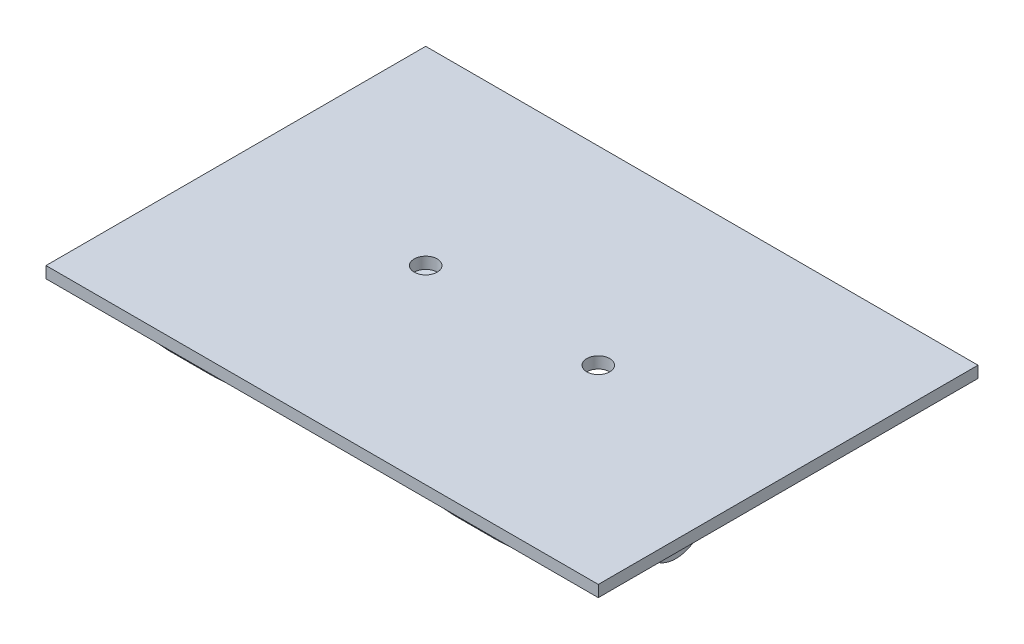
ISO-10303-21;
HEADER;
FILE_DESCRIPTION(('STEP AP214'),'2;1');
FILE_NAME('part.step','',(''),(''),'','','');
FILE_SCHEMA(('AUTOMOTIVE_DESIGN { 1 0 10303 214 1 1 1 1 }'));
ENDSEC;
DATA;
#1=APPLICATION_CONTEXT('core data for automotive mechanical design processes');
#2=APPLICATION_PROTOCOL_DEFINITION('international standard','automotive_design',2000,#1);
#3=PRODUCT_CONTEXT('',#1,'mechanical');
#4=PRODUCT('Part','Part','',(#3));
#5=PRODUCT_RELATED_PRODUCT_CATEGORY('part','',(#4));
#6=PRODUCT_DEFINITION_FORMATION('','',#4);
#7=PRODUCT_DEFINITION_CONTEXT('part definition',#1,'design');
#8=PRODUCT_DEFINITION('design','',#6,#7);
#9=PRODUCT_DEFINITION_SHAPE('','',#8);
#10=(LENGTH_UNIT() NAMED_UNIT(*) SI_UNIT(.MILLI.,.METRE.));
#11=(NAMED_UNIT(*) PLANE_ANGLE_UNIT() SI_UNIT($,.RADIAN.));
#12=(NAMED_UNIT(*) SI_UNIT($,.STERADIAN.) SOLID_ANGLE_UNIT());
#13=UNCERTAINTY_MEASURE_WITH_UNIT(LENGTH_MEASURE(1.E-05),#10,'distance_accuracy_value','');
#14=(GEOMETRIC_REPRESENTATION_CONTEXT(3) GLOBAL_UNCERTAINTY_ASSIGNED_CONTEXT((#13)) GLOBAL_UNIT_ASSIGNED_CONTEXT((#10,
#11,#12)) REPRESENTATION_CONTEXT('',''));
#15=CARTESIAN_POINT('',(0.,0.,0.));
#16=DIRECTION('',(0.,0.,1.));
#17=DIRECTION('',(1.,0.,0.));
#18=AXIS2_PLACEMENT_3D('',#15,#16,#17);
#19=CARTESIAN_POINT('',(0.,2.,0.));
#20=DIRECTION('',(0.,-1.,0.));
#21=DIRECTION('',(0.,0.,-1.));
#22=AXIS2_PLACEMENT_3D('',#19,#20,#21);
#23=PLANE('',#22);
#24=DIRECTION('',(0.,0.,1.));
#25=VECTOR('',#24,1.);
#26=CARTESIAN_POINT('',(0.,2.,0.));
#27=LINE('',#26,#25);
#28=CARTESIAN_POINT('',(0.,2.,-66.));
#29=VERTEX_POINT('',#28);
#30=CARTESIAN_POINT('',(0.,2.,0.));
#31=VERTEX_POINT('',#30);
#32=EDGE_CURVE('E270',#29,#31,#27,.T.);
#33=ORIENTED_EDGE('',*,*,#32,.T.);
#34=DIRECTION('',(1.,0.,0.));
#35=VECTOR('',#34,1.);
#36=CARTESIAN_POINT('',(0.,2.,0.));
#37=LINE('',#36,#35);
#38=CARTESIAN_POINT('',(96.,2.,0.));
#39=VERTEX_POINT('',#38);
#40=EDGE_CURVE('E273',#31,#39,#37,.T.);
#41=ORIENTED_EDGE('',*,*,#40,.T.);
#42=DIRECTION('',(0.,0.,-1.));
#43=VECTOR('',#42,1.);
#44=CARTESIAN_POINT('',(96.,2.,0.));
#45=LINE('',#44,#43);
#46=CARTESIAN_POINT('',(96.,2.,-66.));
#47=VERTEX_POINT('',#46);
#48=EDGE_CURVE('E276',#39,#47,#45,.T.);
#49=ORIENTED_EDGE('',*,*,#48,.T.);
#50=DIRECTION('',(-1.,0.,0.));
#51=VECTOR('',#50,1.);
#52=CARTESIAN_POINT('',(0.,2.,-66.));
#53=LINE('',#52,#51);
#54=EDGE_CURVE('E278',#47,#29,#53,.T.);
#55=ORIENTED_EDGE('',*,*,#54,.T.);
#56=EDGE_LOOP('',(#33,#41,#49,#55));
#57=FACE_BOUND('',#56,.T.);
#58=CARTESIAN_POINT('',(33.,2.,-33.));
#59=DIRECTION('',(0.,1.,0.));
#60=DIRECTION('',(0.,0.,1.));
#61=AXIS2_PLACEMENT_3D('',#58,#59,#60);
#62=CIRCLE('',#61,2.);
#63=CARTESIAN_POINT('',(33.,2.,-31.));
#64=VERTEX_POINT('',#63);
#65=EDGE_CURVE('E264',#64,#64,#62,.T.);
#66=ORIENTED_EDGE('',*,*,#65,.F.);
#67=EDGE_LOOP('',(#66));
#68=FACE_BOUND('',#67,.T.);
#69=CARTESIAN_POINT('',(63.,2.,-33.));
#70=DIRECTION('',(0.,1.,0.));
#71=DIRECTION('',(0.,0.,1.));
#72=AXIS2_PLACEMENT_3D('',#69,#70,#71);
#73=CIRCLE('',#72,2.);
#74=CARTESIAN_POINT('',(63.,2.,-31.));
#75=VERTEX_POINT('',#74);
#76=EDGE_CURVE('E258',#75,#75,#73,.T.);
#77=ORIENTED_EDGE('',*,*,#76,.F.);
#78=EDGE_LOOP('',(#77));
#79=FACE_BOUND('',#78,.T.);
#80=ADVANCED_FACE('F37',(#57,#68,#79),#23,.F.);
#81=CARTESIAN_POINT('',(0.,0.,0.));
#82=DIRECTION('',(0.,-1.,0.));
#83=DIRECTION('',(0.,0.,-1.));
#84=AXIS2_PLACEMENT_3D('',#81,#82,#83);
#85=PLANE('',#84);
#86=DIRECTION('',(0.,0.,-1.));
#87=VECTOR('',#86,1.);
#88=CARTESIAN_POINT('',(76.5,0.,-66.));
#89=LINE('',#88,#87);
#90=CARTESIAN_POINT('',(76.5,0.,-57.4826469157238));
#91=VERTEX_POINT('',#90);
#92=CARTESIAN_POINT('',(76.5,0.,-66.));
#93=VERTEX_POINT('',#92);
#94=EDGE_CURVE('E176',#91,#93,#89,.T.);
#95=ORIENTED_EDGE('',*,*,#94,.T.);
#96=DIRECTION('',(-1.,0.,0.));
#97=VECTOR('',#96,1.);
#98=CARTESIAN_POINT('',(0.,0.,-66.));
#99=LINE('',#98,#97);
#100=CARTESIAN_POINT('',(96.,0.,-66.));
#101=VERTEX_POINT('',#100);
#102=EDGE_CURVE('E274',#101,#93,#99,.T.);
#103=ORIENTED_EDGE('',*,*,#102,.F.);
#104=DIRECTION('',(0.,0.,-1.));
#105=VECTOR('',#104,1.);
#106=CARTESIAN_POINT('',(96.,0.,0.));
#107=LINE('',#106,#105);
#108=CARTESIAN_POINT('',(96.,0.,0.));
#109=VERTEX_POINT('',#108);
#110=EDGE_CURVE('E287',#109,#101,#107,.T.);
#111=ORIENTED_EDGE('',*,*,#110,.F.);
#112=DIRECTION('',(1.,0.,0.));
#113=VECTOR('',#112,1.);
#114=CARTESIAN_POINT('',(0.,0.,0.));
#115=LINE('',#114,#113);
#116=CARTESIAN_POINT('',(76.5,0.,0.));
#117=VERTEX_POINT('',#116);
#118=EDGE_CURVE('E283',#117,#109,#115,.T.);
#119=ORIENTED_EDGE('',*,*,#118,.F.);
#120=DIRECTION('',(0.,0.,-1.));
#121=VECTOR('',#120,1.);
#122=CARTESIAN_POINT('',(76.5,0.,-8.51735308427622));
#123=LINE('',#122,#121);
#124=CARTESIAN_POINT('',(76.5,0.,-8.51735308427622));
#125=VERTEX_POINT('',#124);
#126=EDGE_CURVE('E52',#117,#125,#123,.T.);
#127=ORIENTED_EDGE('',*,*,#126,.T.);
#128=DIRECTION('',(-1.,0.,0.));
#129=VECTOR('',#128,1.);
#130=CARTESIAN_POINT('',(76.5,0.,-8.51735308427622));
#131=LINE('',#130,#129);
#132=CARTESIAN_POINT('',(69.,0.,-8.51735308427622));
#133=VERTEX_POINT('',#132);
#134=EDGE_CURVE('E199',#125,#133,#131,.T.);
#135=ORIENTED_EDGE('',*,*,#134,.T.);
#136=DIRECTION('',(0.,0.,-1.));
#137=VECTOR('',#136,1.);
#138=CARTESIAN_POINT('',(69.,0.,-8.51735308427622));
#139=LINE('',#138,#137);
#140=CARTESIAN_POINT('',(69.,0.,0.));
#141=VERTEX_POINT('',#140);
#142=EDGE_CURVE('E171',#141,#133,#139,.T.);
#143=ORIENTED_EDGE('',*,*,#142,.F.);
#144=CARTESIAN_POINT('',(27.,0.,0.));
#145=VERTEX_POINT('',#144);
#146=EDGE_CURVE('E288',#145,#141,#115,.T.);
#147=ORIENTED_EDGE('',*,*,#146,.F.);
#148=DIRECTION('',(0.,0.,-1.));
#149=VECTOR('',#148,1.);
#150=CARTESIAN_POINT('',(27.,0.,-8.51735308427621));
#151=LINE('',#150,#149);
#152=CARTESIAN_POINT('',(27.,0.,-8.51735308427621));
#153=VERTEX_POINT('',#152);
#154=EDGE_CURVE('E230',#145,#153,#151,.T.);
#155=ORIENTED_EDGE('',*,*,#154,.T.);
#156=DIRECTION('',(1.,0.,0.));
#157=VECTOR('',#156,1.);
#158=CARTESIAN_POINT('',(19.5,0.,-8.51735308427621));
#159=LINE('',#158,#157);
#160=CARTESIAN_POINT('',(19.5,0.,-8.51735308427621));
#161=VERTEX_POINT('',#160);
#162=EDGE_CURVE('E252',#161,#153,#159,.T.);
#163=ORIENTED_EDGE('',*,*,#162,.F.);
#164=DIRECTION('',(0.,0.,-1.));
#165=VECTOR('',#164,1.);
#166=CARTESIAN_POINT('',(19.5,0.,-8.51735308427621));
#167=LINE('',#166,#165);
#168=CARTESIAN_POINT('',(19.5,0.,0.));
#169=VERTEX_POINT('',#168);
#170=EDGE_CURVE('E216',#169,#161,#167,.T.);
#171=ORIENTED_EDGE('',*,*,#170,.F.);
#172=CARTESIAN_POINT('',(0.,0.,0.));
#173=VERTEX_POINT('',#172);
#174=EDGE_CURVE('E284',#173,#169,#115,.T.);
#175=ORIENTED_EDGE('',*,*,#174,.F.);
#176=DIRECTION('',(0.,0.,1.));
#177=VECTOR('',#176,1.);
#178=CARTESIAN_POINT('',(0.,0.,0.));
#179=LINE('',#178,#177);
#180=CARTESIAN_POINT('',(0.,0.,-66.));
#181=VERTEX_POINT('',#180);
#182=EDGE_CURVE('E267',#181,#173,#179,.T.);
#183=ORIENTED_EDGE('',*,*,#182,.F.);
#184=CARTESIAN_POINT('',(19.5,0.,-66.));
#185=VERTEX_POINT('',#184);
#186=EDGE_CURVE('E290',#185,#181,#99,.T.);
#187=ORIENTED_EDGE('',*,*,#186,.F.);
#188=DIRECTION('',(0.,0.,-1.));
#189=VECTOR('',#188,1.);
#190=CARTESIAN_POINT('',(19.5,0.,-66.));
#191=LINE('',#190,#189);
#192=CARTESIAN_POINT('',(19.5,0.,-57.4826469157238));
#193=VERTEX_POINT('',#192);
#194=EDGE_CURVE('E221',#193,#185,#191,.T.);
#195=ORIENTED_EDGE('',*,*,#194,.F.);
#196=DIRECTION('',(1.,0.,0.));
#197=VECTOR('',#196,1.);
#198=CARTESIAN_POINT('',(19.5,0.,-57.4826469157238));
#199=LINE('',#198,#197);
#200=CARTESIAN_POINT('',(27.,0.,-57.4826469157238));
#201=VERTEX_POINT('',#200);
#202=EDGE_CURVE('E249',#193,#201,#199,.T.);
#203=ORIENTED_EDGE('',*,*,#202,.T.);
#204=DIRECTION('',(0.,0.,-1.));
#205=VECTOR('',#204,1.);
#206=CARTESIAN_POINT('',(27.,0.,-66.));
#207=LINE('',#206,#205);
#208=CARTESIAN_POINT('',(27.,0.,-66.));
#209=VERTEX_POINT('',#208);
#210=EDGE_CURVE('E235',#201,#209,#207,.T.);
#211=ORIENTED_EDGE('',*,*,#210,.T.);
#212=CARTESIAN_POINT('',(69.,0.,-66.));
#213=VERTEX_POINT('',#212);
#214=EDGE_CURVE('E293',#213,#209,#99,.T.);
#215=ORIENTED_EDGE('',*,*,#214,.F.);
#216=DIRECTION('',(0.,0.,-1.));
#217=VECTOR('',#216,1.);
#218=CARTESIAN_POINT('',(69.,0.,-66.));
#219=LINE('',#218,#217);
#220=CARTESIAN_POINT('',(69.,0.,-57.4826469157238));
#221=VERTEX_POINT('',#220);
#222=EDGE_CURVE('E60',#221,#213,#219,.T.);
#223=ORIENTED_EDGE('',*,*,#222,.F.);
#224=DIRECTION('',(-1.,0.,0.));
#225=VECTOR('',#224,1.);
#226=CARTESIAN_POINT('',(76.5,0.,-57.4826469157238));
#227=LINE('',#226,#225);
#228=EDGE_CURVE('E202',#91,#221,#227,.T.);
#229=ORIENTED_EDGE('',*,*,#228,.F.);
#230=EDGE_LOOP('',(#95,#103,#111,#119,#127,#135,#143,#147,#155,#163,#171,#175,#183,#187,#195,
#203,#211,#215,#223,#229));
#231=FACE_BOUND('',#230,.T.);
#232=CARTESIAN_POINT('',(33.,0.,-33.));
#233=DIRECTION('',(0.,1.,0.));
#234=DIRECTION('',(0.,0.,1.));
#235=AXIS2_PLACEMENT_3D('',#232,#233,#234);
#236=CIRCLE('',#235,2.);
#237=CARTESIAN_POINT('',(33.,0.,-31.));
#238=VERTEX_POINT('',#237);
#239=EDGE_CURVE('E261',#238,#238,#236,.T.);
#240=ORIENTED_EDGE('',*,*,#239,.T.);
#241=EDGE_LOOP('',(#240));
#242=FACE_BOUND('',#241,.T.);
#243=CARTESIAN_POINT('',(63.,0.,-33.));
#244=DIRECTION('',(0.,1.,0.));
#245=DIRECTION('',(0.,0.,1.));
#246=AXIS2_PLACEMENT_3D('',#243,#244,#245);
#247=CIRCLE('',#246,2.);
#248=CARTESIAN_POINT('',(63.,0.,-31.));
#249=VERTEX_POINT('',#248);
#250=EDGE_CURVE('E257',#249,#249,#247,.T.);
#251=ORIENTED_EDGE('',*,*,#250,.T.);
#252=EDGE_LOOP('',(#251));
#253=FACE_BOUND('',#252,.T.);
#254=ADVANCED_FACE('F308',(#231,#242,#253),#85,.T.);
#255=CARTESIAN_POINT('',(0.,2.,0.));
#256=DIRECTION('',(1.,0.,0.));
#257=DIRECTION('',(0.,0.,-1.));
#258=AXIS2_PLACEMENT_3D('',#255,#256,#257);
#259=PLANE('',#258);
#260=ORIENTED_EDGE('',*,*,#182,.T.);
#261=DIRECTION('',(0.,-1.,0.));
#262=VECTOR('',#261,1.);
#263=CARTESIAN_POINT('',(0.,2.,0.));
#264=LINE('',#263,#262);
#265=EDGE_CURVE('E11',#31,#173,#264,.T.);
#266=ORIENTED_EDGE('',*,*,#265,.F.);
#267=ORIENTED_EDGE('',*,*,#32,.F.);
#268=DIRECTION('',(0.,-1.,0.));
#269=VECTOR('',#268,1.);
#270=CARTESIAN_POINT('',(0.,2.,-66.));
#271=LINE('',#270,#269);
#272=EDGE_CURVE('E280',#29,#181,#271,.T.);
#273=ORIENTED_EDGE('',*,*,#272,.T.);
#274=EDGE_LOOP('',(#260,#266,#267,#273));
#275=FACE_BOUND('',#274,.T.);
#276=ADVANCED_FACE('F39',(#275),#259,.F.);
#277=CARTESIAN_POINT('',(0.,2.,0.));
#278=DIRECTION('',(0.,0.,-1.));
#279=DIRECTION('',(-1.,0.,0.));
#280=AXIS2_PLACEMENT_3D('',#277,#278,#279);
#281=PLANE('',#280);
#282=ORIENTED_EDGE('',*,*,#174,.T.);
#283=DIRECTION('',(1.,0.,0.));
#284=VECTOR('',#283,1.);
#285=CARTESIAN_POINT('',(19.5,0.,0.));
#286=LINE('',#285,#284);
#287=EDGE_CURVE('E254',#169,#145,#286,.T.);
#288=ORIENTED_EDGE('',*,*,#287,.T.);
#289=ORIENTED_EDGE('',*,*,#146,.T.);
#290=DIRECTION('',(-1.,0.,0.));
#291=VECTOR('',#290,1.);
#292=CARTESIAN_POINT('',(76.5,0.,0.));
#293=LINE('',#292,#291);
#294=EDGE_CURVE('E186',#117,#141,#293,.T.);
#295=ORIENTED_EDGE('',*,*,#294,.F.);
#296=ORIENTED_EDGE('',*,*,#118,.T.);
#297=DIRECTION('',(0.,-1.,0.));
#298=VECTOR('',#297,1.);
#299=CARTESIAN_POINT('',(96.,2.,0.));
#300=LINE('',#299,#298);
#301=EDGE_CURVE('E45',#39,#109,#300,.T.);
#302=ORIENTED_EDGE('',*,*,#301,.F.);
#303=ORIENTED_EDGE('',*,*,#40,.F.);
#304=ORIENTED_EDGE('',*,*,#265,.T.);
#305=EDGE_LOOP('',(#282,#288,#289,#295,#296,#302,#303,#304));
#306=FACE_BOUND('',#305,.T.);
#307=ADVANCED_FACE('F320',(#306),#281,.F.);
#308=CARTESIAN_POINT('',(96.,2.,0.));
#309=DIRECTION('',(-1.,0.,0.));
#310=DIRECTION('',(0.,0.,1.));
#311=AXIS2_PLACEMENT_3D('',#308,#309,#310);
#312=PLANE('',#311);
#313=ORIENTED_EDGE('',*,*,#110,.T.);
#314=DIRECTION('',(0.,-1.,0.));
#315=VECTOR('',#314,1.);
#316=CARTESIAN_POINT('',(96.,2.,-66.));
#317=LINE('',#316,#315);
#318=EDGE_CURVE('E296',#47,#101,#317,.T.);
#319=ORIENTED_EDGE('',*,*,#318,.F.);
#320=ORIENTED_EDGE('',*,*,#48,.F.);
#321=ORIENTED_EDGE('',*,*,#301,.T.);
#322=EDGE_LOOP('',(#313,#319,#320,#321));
#323=FACE_BOUND('',#322,.T.);
#324=ADVANCED_FACE('F303',(#323),#312,.F.);
#325=CARTESIAN_POINT('',(0.,2.,-66.));
#326=DIRECTION('',(0.,0.,1.));
#327=DIRECTION('',(1.,0.,0.));
#328=AXIS2_PLACEMENT_3D('',#325,#326,#327);
#329=PLANE('',#328);
#330=ORIENTED_EDGE('',*,*,#102,.T.);
#331=DIRECTION('',(-1.,0.,0.));
#332=VECTOR('',#331,1.);
#333=CARTESIAN_POINT('',(76.5,0.,-66.));
#334=LINE('',#333,#332);
#335=EDGE_CURVE('E204',#93,#213,#334,.T.);
#336=ORIENTED_EDGE('',*,*,#335,.T.);
#337=ORIENTED_EDGE('',*,*,#214,.T.);
#338=DIRECTION('',(1.,0.,0.));
#339=VECTOR('',#338,1.);
#340=CARTESIAN_POINT('',(19.5,0.,-66.));
#341=LINE('',#340,#339);
#342=EDGE_CURVE('E246',#185,#209,#341,.T.);
#343=ORIENTED_EDGE('',*,*,#342,.F.);
#344=ORIENTED_EDGE('',*,*,#186,.T.);
#345=ORIENTED_EDGE('',*,*,#272,.F.);
#346=ORIENTED_EDGE('',*,*,#54,.F.);
#347=ORIENTED_EDGE('',*,*,#318,.T.);
#348=EDGE_LOOP('',(#330,#336,#337,#343,#344,#345,#346,#347));
#349=FACE_BOUND('',#348,.T.);
#350=ADVANCED_FACE('F313',(#349),#329,.F.);
#351=CARTESIAN_POINT('',(33.,2.,-33.));
#352=DIRECTION('',(0.,-1.,0.));
#353=DIRECTION('',(0.,0.,-1.));
#354=AXIS2_PLACEMENT_3D('',#351,#352,#353);
#355=CYLINDRICAL_SURFACE('',#354,2.);
#356=ORIENTED_EDGE('',*,*,#65,.T.);
#357=EDGE_LOOP('',(#356));
#358=FACE_BOUND('',#357,.T.);
#359=ORIENTED_EDGE('',*,*,#239,.F.);
#360=EDGE_LOOP('',(#359));
#361=FACE_BOUND('',#360,.T.);
#362=ADVANCED_FACE('F384',(#358,#361),#355,.F.);
#363=CARTESIAN_POINT('',(63.,2.,-33.));
#364=DIRECTION('',(0.,-1.,0.));
#365=DIRECTION('',(0.,0.,-1.));
#366=AXIS2_PLACEMENT_3D('',#363,#364,#365);
#367=CYLINDRICAL_SURFACE('',#366,2.);
#368=ORIENTED_EDGE('',*,*,#76,.T.);
#369=EDGE_LOOP('',(#368));
#370=FACE_BOUND('',#369,.T.);
#371=ORIENTED_EDGE('',*,*,#250,.F.);
#372=EDGE_LOOP('',(#371));
#373=FACE_BOUND('',#372,.T.);
#374=ADVANCED_FACE('F527',(#370,#373),#367,.F.);
#375=CARTESIAN_POINT('',(19.5,28.8,-33.));
#376=DIRECTION('',(-1.,0.,0.));
#377=DIRECTION('',(0.,0.,1.));
#378=AXIS2_PLACEMENT_3D('',#375,#376,#377);
#379=PLANE('',#378);
#380=CARTESIAN_POINT('',(19.5,28.8,-33.));
#381=DIRECTION('',(-1.,0.,0.));
#382=DIRECTION('',(0.,0.,1.));
#383=AXIS2_PLACEMENT_3D('',#380,#381,#382);
#384=CIRCLE('',#383,43.8);
#385=CARTESIAN_POINT('',(19.5,-14.6701983447488,-27.6351276000082));
#386=VERTEX_POINT('',#385);
#387=EDGE_CURVE('E214',#386,#169,#384,.T.);
#388=ORIENTED_EDGE('',*,*,#387,.T.);
#389=ORIENTED_EDGE('',*,*,#170,.T.);
#390=CARTESIAN_POINT('',(19.5,28.8,-33.));
#391=DIRECTION('',(1.,0.,0.));
#392=DIRECTION('',(0.,0.,-1.));
#393=AXIS2_PLACEMENT_3D('',#390,#391,#392);
#394=CIRCLE('',#393,37.8);
#395=EDGE_CURVE('E219',#161,#193,#394,.T.);
#396=ORIENTED_EDGE('',*,*,#395,.T.);
#397=ORIENTED_EDGE('',*,*,#194,.T.);
#398=CARTESIAN_POINT('',(19.5,28.8,-33.));
#399=DIRECTION('',(-1.,0.,0.));
#400=DIRECTION('',(0.,0.,1.));
#401=AXIS2_PLACEMENT_3D('',#398,#399,#400);
#402=CIRCLE('',#401,43.8);
#403=CARTESIAN_POINT('',(19.5,-14.6701983447489,-38.3648723999918));
#404=VERTEX_POINT('',#403);
#405=EDGE_CURVE('E224',#185,#404,#402,.T.);
#406=ORIENTED_EDGE('',*,*,#405,.T.);
#407=CARTESIAN_POINT('',(19.5,-15.,-33.));
#408=DIRECTION('',(-1.,0.,0.));
#409=DIRECTION('',(0.,0.,1.));
#410=AXIS2_PLACEMENT_3D('',#407,#408,#409);
#411=CIRCLE('',#410,5.375);
#412=EDGE_CURVE('E226',#404,#386,#411,.T.);
#413=ORIENTED_EDGE('',*,*,#412,.T.);
#414=EDGE_LOOP('',(#388,#389,#396,#397,#406,#413));
#415=FACE_BOUND('',#414,.T.);
#416=CARTESIAN_POINT('',(19.5,-15.,-33.));
#417=DIRECTION('',(-1.,0.,0.));
#418=DIRECTION('',(0.,0.,1.));
#419=AXIS2_PLACEMENT_3D('',#416,#417,#418);
#420=CIRCLE('',#419,2.375);
#421=CARTESIAN_POINT('',(19.5,-15.,-30.625));
#422=VERTEX_POINT('',#421);
#423=EDGE_CURVE('E208',#422,#422,#420,.T.);
#424=ORIENTED_EDGE('',*,*,#423,.F.);
#425=EDGE_LOOP('',(#424));
#426=FACE_BOUND('',#425,.T.);
#427=ADVANCED_FACE('F330',(#415,#426),#379,.T.);
#428=CARTESIAN_POINT('',(27.,28.8,-33.));
#429=DIRECTION('',(-1.,0.,0.));
#430=DIRECTION('',(0.,0.,1.));
#431=AXIS2_PLACEMENT_3D('',#428,#429,#430);
#432=PLANE('',#431);
#433=CARTESIAN_POINT('',(27.,28.8,-33.));
#434=DIRECTION('',(-1.,0.,0.));
#435=DIRECTION('',(0.,0.,1.));
#436=AXIS2_PLACEMENT_3D('',#433,#434,#435);
#437=CIRCLE('',#436,43.8);
#438=CARTESIAN_POINT('',(27.,-14.6701983447488,-27.6351276000082));
#439=VERTEX_POINT('',#438);
#440=EDGE_CURVE('E211',#439,#145,#437,.T.);
#441=ORIENTED_EDGE('',*,*,#440,.F.);
#442=CARTESIAN_POINT('',(27.,-15.,-33.));
#443=DIRECTION('',(-1.,0.,0.));
#444=DIRECTION('',(0.,0.,1.));
#445=AXIS2_PLACEMENT_3D('',#442,#443,#444);
#446=CIRCLE('',#445,5.375);
#447=CARTESIAN_POINT('',(27.,-14.6701983447489,-38.3648723999918));
#448=VERTEX_POINT('',#447);
#449=EDGE_CURVE('E217',#448,#439,#446,.T.);
#450=ORIENTED_EDGE('',*,*,#449,.F.);
#451=CARTESIAN_POINT('',(27.,28.8,-33.));
#452=DIRECTION('',(-1.,0.,0.));
#453=DIRECTION('',(0.,0.,1.));
#454=AXIS2_PLACEMENT_3D('',#451,#452,#453);
#455=CIRCLE('',#454,43.8);
#456=EDGE_CURVE('E238',#209,#448,#455,.T.);
#457=ORIENTED_EDGE('',*,*,#456,.F.);
#458=ORIENTED_EDGE('',*,*,#210,.F.);
#459=CARTESIAN_POINT('',(27.,28.8,-33.));
#460=DIRECTION('',(1.,0.,0.));
#461=DIRECTION('',(0.,0.,-1.));
#462=AXIS2_PLACEMENT_3D('',#459,#460,#461);
#463=CIRCLE('',#462,37.8);
#464=EDGE_CURVE('E233',#153,#201,#463,.T.);
#465=ORIENTED_EDGE('',*,*,#464,.F.);
#466=ORIENTED_EDGE('',*,*,#154,.F.);
#467=EDGE_LOOP('',(#441,#450,#457,#458,#465,#466));
#468=FACE_BOUND('',#467,.T.);
#469=CARTESIAN_POINT('',(27.,-15.,-33.));
#470=DIRECTION('',(-1.,0.,0.));
#471=DIRECTION('',(0.,0.,1.));
#472=AXIS2_PLACEMENT_3D('',#469,#470,#471);
#473=CIRCLE('',#472,2.375);
#474=CARTESIAN_POINT('',(27.,-15.,-30.625));
#475=VERTEX_POINT('',#474);
#476=EDGE_CURVE('E163',#475,#475,#473,.T.);
#477=ORIENTED_EDGE('',*,*,#476,.T.);
#478=EDGE_LOOP('',(#477));
#479=FACE_BOUND('',#478,.T.);
#480=ADVANCED_FACE('F360',(#468,#479),#432,.F.);
#481=CARTESIAN_POINT('',(19.5,28.8,-33.));
#482=DIRECTION('',(1.,0.,0.));
#483=DIRECTION('',(0.,0.,-1.));
#484=AXIS2_PLACEMENT_3D('',#481,#482,#483);
#485=CYLINDRICAL_SURFACE('',#484,43.8);
#486=ORIENTED_EDGE('',*,*,#440,.T.);
#487=ORIENTED_EDGE('',*,*,#287,.F.);
#488=ORIENTED_EDGE('',*,*,#387,.F.);
#489=DIRECTION('',(1.,0.,0.));
#490=VECTOR('',#489,1.);
#491=CARTESIAN_POINT('',(19.5,-14.6701983447488,-27.6351276000082));
#492=LINE('',#491,#490);
#493=EDGE_CURVE('E228',#386,#439,#492,.T.);
#494=ORIENTED_EDGE('',*,*,#493,.T.);
#495=EDGE_LOOP('',(#486,#487,#488,#494));
#496=FACE_BOUND('',#495,.T.);
#497=ADVANCED_FACE('F350',(#496),#485,.T.);
#498=CARTESIAN_POINT('',(19.5,28.8,-33.));
#499=DIRECTION('',(1.,0.,0.));
#500=DIRECTION('',(0.,0.,-1.));
#501=AXIS2_PLACEMENT_3D('',#498,#499,#500);
#502=CYLINDRICAL_SURFACE('',#501,37.8);
#503=ORIENTED_EDGE('',*,*,#464,.T.);
#504=ORIENTED_EDGE('',*,*,#202,.F.);
#505=ORIENTED_EDGE('',*,*,#395,.F.);
#506=ORIENTED_EDGE('',*,*,#162,.T.);
#507=EDGE_LOOP('',(#503,#504,#505,#506));
#508=FACE_BOUND('',#507,.T.);
#509=ADVANCED_FACE('F336',(#508),#502,.F.);
#510=CARTESIAN_POINT('',(19.5,28.8,-33.));
#511=DIRECTION('',(1.,0.,0.));
#512=DIRECTION('',(0.,0.,-1.));
#513=AXIS2_PLACEMENT_3D('',#510,#511,#512);
#514=CYLINDRICAL_SURFACE('',#513,43.8);
#515=ORIENTED_EDGE('',*,*,#456,.T.);
#516=DIRECTION('',(1.,0.,0.));
#517=VECTOR('',#516,1.);
#518=CARTESIAN_POINT('',(19.5,-14.6701983447489,-38.3648723999918));
#519=LINE('',#518,#517);
#520=EDGE_CURVE('E243',#404,#448,#519,.T.);
#521=ORIENTED_EDGE('',*,*,#520,.F.);
#522=ORIENTED_EDGE('',*,*,#405,.F.);
#523=ORIENTED_EDGE('',*,*,#342,.T.);
#524=EDGE_LOOP('',(#515,#521,#522,#523));
#525=FACE_BOUND('',#524,.T.);
#526=ADVANCED_FACE('F343',(#525),#514,.T.);
#527=CARTESIAN_POINT('',(19.5,-15.,-33.));
#528=DIRECTION('',(1.,0.,0.));
#529=DIRECTION('',(0.,0.,-1.));
#530=AXIS2_PLACEMENT_3D('',#527,#528,#529);
#531=CYLINDRICAL_SURFACE('',#530,5.375);
#532=ORIENTED_EDGE('',*,*,#449,.T.);
#533=ORIENTED_EDGE('',*,*,#493,.F.);
#534=ORIENTED_EDGE('',*,*,#412,.F.);
#535=ORIENTED_EDGE('',*,*,#520,.T.);
#536=EDGE_LOOP('',(#532,#533,#534,#535));
#537=FACE_BOUND('',#536,.T.);
#538=ADVANCED_FACE('F347',(#537),#531,.T.);
#539=CARTESIAN_POINT('',(19.5,-15.,-33.));
#540=DIRECTION('',(1.,0.,0.));
#541=DIRECTION('',(0.,0.,-1.));
#542=AXIS2_PLACEMENT_3D('',#539,#540,#541);
#543=CYLINDRICAL_SURFACE('',#542,2.375);
#544=ORIENTED_EDGE('',*,*,#423,.T.);
#545=EDGE_LOOP('',(#544));
#546=FACE_BOUND('',#545,.T.);
#547=ORIENTED_EDGE('',*,*,#476,.F.);
#548=EDGE_LOOP('',(#547));
#549=FACE_BOUND('',#548,.T.);
#550=ADVANCED_FACE('F366',(#546,#549),#543,.F.);
#551=CARTESIAN_POINT('',(76.5,28.8,-33.));
#552=DIRECTION('',(-1.,0.,0.));
#553=DIRECTION('',(0.,0.,1.));
#554=AXIS2_PLACEMENT_3D('',#551,#552,#553);
#555=CYLINDRICAL_SURFACE('',#554,43.8);
#556=CARTESIAN_POINT('',(69.,28.8,-33.));
#557=DIRECTION('',(-1.,0.,0.));
#558=DIRECTION('',(0.,0.,1.));
#559=AXIS2_PLACEMENT_3D('',#556,#557,#558);
#560=CIRCLE('',#559,43.8);
#561=CARTESIAN_POINT('',(69.,-14.6701983447488,-27.6351276000082));
#562=VERTEX_POINT('',#561);
#563=EDGE_CURVE('E158',#562,#141,#560,.T.);
#564=ORIENTED_EDGE('',*,*,#563,.F.);
#565=DIRECTION('',(-1.,0.,0.));
#566=VECTOR('',#565,1.);
#567=CARTESIAN_POINT('',(76.5,-14.6701983447488,-27.6351276000082));
#568=LINE('',#567,#566);
#569=CARTESIAN_POINT('',(76.5,-14.6701983447488,-27.6351276000082));
#570=VERTEX_POINT('',#569);
#571=EDGE_CURVE('E153',#570,#562,#568,.T.);
#572=ORIENTED_EDGE('',*,*,#571,.F.);
#573=CARTESIAN_POINT('',(76.5,28.8,-33.));
#574=DIRECTION('',(-1.,0.,0.));
#575=DIRECTION('',(0.,0.,1.));
#576=AXIS2_PLACEMENT_3D('',#573,#574,#575);
#577=CIRCLE('',#576,43.8);
#578=EDGE_CURVE('E155',#570,#117,#577,.T.);
#579=ORIENTED_EDGE('',*,*,#578,.T.);
#580=ORIENTED_EDGE('',*,*,#294,.T.);
#581=EDGE_LOOP('',(#564,#572,#579,#580));
#582=FACE_BOUND('',#581,.T.);
#583=ADVANCED_FACE('F154',(#582),#555,.T.);
#584=CARTESIAN_POINT('',(76.5,-15.,-33.));
#585=DIRECTION('',(-1.,0.,0.));
#586=DIRECTION('',(0.,0.,1.));
#587=AXIS2_PLACEMENT_3D('',#584,#585,#586);
#588=CYLINDRICAL_SURFACE('',#587,5.375);
#589=CARTESIAN_POINT('',(69.,-15.,-33.));
#590=DIRECTION('',(-1.,0.,0.));
#591=DIRECTION('',(0.,0.,1.));
#592=AXIS2_PLACEMENT_3D('',#589,#590,#591);
#593=CIRCLE('',#592,5.375);
#594=CARTESIAN_POINT('',(69.,-14.6701983447489,-38.3648723999918));
#595=VERTEX_POINT('',#594);
#596=EDGE_CURVE('E188',#595,#562,#593,.T.);
#597=ORIENTED_EDGE('',*,*,#596,.F.);
#598=DIRECTION('',(-1.,0.,0.));
#599=VECTOR('',#598,1.);
#600=CARTESIAN_POINT('',(76.5,-14.6701983447489,-38.3648723999918));
#601=LINE('',#600,#599);
#602=CARTESIAN_POINT('',(76.5,-14.6701983447489,-38.3648723999918));
#603=VERTEX_POINT('',#602);
#604=EDGE_CURVE('E164',#603,#595,#601,.T.);
#605=ORIENTED_EDGE('',*,*,#604,.F.);
#606=CARTESIAN_POINT('',(76.5,-15.,-33.));
#607=DIRECTION('',(-1.,0.,0.));
#608=DIRECTION('',(0.,0.,1.));
#609=AXIS2_PLACEMENT_3D('',#606,#607,#608);
#610=CIRCLE('',#609,5.375);
#611=EDGE_CURVE('E169',#603,#570,#610,.T.);
#612=ORIENTED_EDGE('',*,*,#611,.T.);
#613=ORIENTED_EDGE('',*,*,#571,.T.);
#614=EDGE_LOOP('',(#597,#605,#612,#613));
#615=FACE_BOUND('',#614,.T.);
#616=ADVANCED_FACE('F173',(#615),#588,.T.);
#617=CARTESIAN_POINT('',(76.5,28.8,-33.));
#618=DIRECTION('',(-1.,0.,0.));
#619=DIRECTION('',(0.,0.,1.));
#620=AXIS2_PLACEMENT_3D('',#617,#618,#619);
#621=CYLINDRICAL_SURFACE('',#620,43.8);
#622=CARTESIAN_POINT('',(69.,28.8,-33.));
#623=DIRECTION('',(-1.,0.,0.));
#624=DIRECTION('',(0.,0.,1.));
#625=AXIS2_PLACEMENT_3D('',#622,#623,#624);
#626=CIRCLE('',#625,43.8);
#627=EDGE_CURVE('E191',#213,#595,#626,.T.);
#628=ORIENTED_EDGE('',*,*,#627,.F.);
#629=ORIENTED_EDGE('',*,*,#335,.F.);
#630=CARTESIAN_POINT('',(76.5,28.8,-33.));
#631=DIRECTION('',(-1.,0.,0.));
#632=DIRECTION('',(0.,0.,1.));
#633=AXIS2_PLACEMENT_3D('',#630,#631,#632);
#634=CIRCLE('',#633,43.8);
#635=EDGE_CURVE('E174',#93,#603,#634,.T.);
#636=ORIENTED_EDGE('',*,*,#635,.T.);
#637=ORIENTED_EDGE('',*,*,#604,.T.);
#638=EDGE_LOOP('',(#628,#629,#636,#637));
#639=FACE_BOUND('',#638,.T.);
#640=ADVANCED_FACE('F358',(#639),#621,.T.);
#641=CARTESIAN_POINT('',(76.5,28.8,-33.));
#642=DIRECTION('',(-1.,0.,0.));
#643=DIRECTION('',(0.,0.,1.));
#644=AXIS2_PLACEMENT_3D('',#641,#642,#643);
#645=CYLINDRICAL_SURFACE('',#644,37.8);
#646=CARTESIAN_POINT('',(69.,28.8,-33.));
#647=DIRECTION('',(1.,0.,0.));
#648=DIRECTION('',(0.,0.,-1.));
#649=AXIS2_PLACEMENT_3D('',#646,#647,#648);
#650=CIRCLE('',#649,37.8);
#651=EDGE_CURVE('E194',#133,#221,#650,.T.);
#652=ORIENTED_EDGE('',*,*,#651,.F.);
#653=ORIENTED_EDGE('',*,*,#134,.F.);
#654=CARTESIAN_POINT('',(76.5,28.8,-33.));
#655=DIRECTION('',(1.,0.,0.));
#656=DIRECTION('',(0.,0.,-1.));
#657=AXIS2_PLACEMENT_3D('',#654,#655,#656);
#658=CIRCLE('',#657,37.8);
#659=EDGE_CURVE('E182',#125,#91,#658,.T.);
#660=ORIENTED_EDGE('',*,*,#659,.T.);
#661=ORIENTED_EDGE('',*,*,#228,.T.);
#662=EDGE_LOOP('',(#652,#653,#660,#661));
#663=FACE_BOUND('',#662,.T.);
#664=ADVANCED_FACE('F441',(#663),#645,.F.);
#665=CARTESIAN_POINT('',(76.5,28.8,-33.));
#666=DIRECTION('',(1.,0.,0.));
#667=DIRECTION('',(0.,0.,1.));
#668=AXIS2_PLACEMENT_3D('',#665,#666,#667);
#669=PLANE('',#668);
#670=CARTESIAN_POINT('',(76.5,-15.,-33.));
#671=DIRECTION('',(1.,0.,0.));
#672=DIRECTION('',(0.,0.,-1.));
#673=AXIS2_PLACEMENT_3D('',#670,#671,#672);
#674=CIRCLE('',#673,2.55);
#675=CARTESIAN_POINT('',(76.5,-15.,-35.55));
#676=VERTEX_POINT('',#675);
#677=EDGE_CURVE('E487',#676,#676,#674,.T.);
#678=ORIENTED_EDGE('',*,*,#677,.F.);
#679=EDGE_LOOP('',(#678));
#680=FACE_BOUND('',#679,.T.);
#681=ORIENTED_EDGE('',*,*,#578,.F.);
#682=ORIENTED_EDGE('',*,*,#611,.F.);
#683=ORIENTED_EDGE('',*,*,#635,.F.);
#684=ORIENTED_EDGE('',*,*,#94,.F.);
#685=ORIENTED_EDGE('',*,*,#659,.F.);
#686=ORIENTED_EDGE('',*,*,#126,.F.);
#687=EDGE_LOOP('',(#681,#682,#683,#684,#685,#686));
#688=FACE_BOUND('',#687,.T.);
#689=ADVANCED_FACE('F167',(#680,#688),#669,.T.);
#690=CARTESIAN_POINT('',(69.,28.8,-33.));
#691=DIRECTION('',(1.,0.,0.));
#692=DIRECTION('',(0.,0.,1.));
#693=AXIS2_PLACEMENT_3D('',#690,#691,#692);
#694=PLANE('',#693);
#695=CARTESIAN_POINT('',(69.,-15.,-33.));
#696=DIRECTION('',(1.,0.,0.));
#697=DIRECTION('',(0.,0.,-1.));
#698=AXIS2_PLACEMENT_3D('',#695,#696,#697);
#699=CIRCLE('',#698,2.55);
#700=CARTESIAN_POINT('',(69.,-15.,-35.55));
#701=VERTEX_POINT('',#700);
#702=EDGE_CURVE('E189',#701,#701,#699,.F.);
#703=ORIENTED_EDGE('',*,*,#702,.F.);
#704=EDGE_LOOP('',(#703));
#705=FACE_BOUND('',#704,.T.);
#706=ORIENTED_EDGE('',*,*,#563,.T.);
#707=ORIENTED_EDGE('',*,*,#142,.T.);
#708=ORIENTED_EDGE('',*,*,#651,.T.);
#709=ORIENTED_EDGE('',*,*,#222,.T.);
#710=ORIENTED_EDGE('',*,*,#627,.T.);
#711=ORIENTED_EDGE('',*,*,#596,.T.);
#712=EDGE_LOOP('',(#706,#707,#708,#709,#710,#711));
#713=FACE_BOUND('',#712,.T.);
#714=ADVANCED_FACE('F355',(#705,#713),#694,.F.);
#715=CARTESIAN_POINT('',(61.7875108318972,-15.,-33.));
#716=DIRECTION('',(1.,0.,0.));
#717=DIRECTION('',(0.,0.,-1.));
#718=AXIS2_PLACEMENT_3D('',#715,#716,#717);
#719=CYLINDRICAL_SURFACE('',#718,2.55);
#720=ORIENTED_EDGE('',*,*,#702,.T.);
#721=EDGE_LOOP('',(#720));
#722=FACE_BOUND('',#721,.T.);
#723=ORIENTED_EDGE('',*,*,#677,.T.);
#724=EDGE_LOOP('',(#723));
#725=FACE_BOUND('',#724,.T.);
#726=ADVANCED_FACE('F468',(#722,#725),#719,.F.);
#727=CLOSED_SHELL('',(#80,#254,#276,#307,#324,#350,#362,#374,#427,#480,#497,#509,#526,#538,#550,
#583,#616,#640,#664,#689,#714,#726));
#728=MANIFOLD_SOLID_BREP('B2',#727);
#729=ADVANCED_BREP_SHAPE_REPRESENTATION('',(#18,#728),#14);
#730=SHAPE_DEFINITION_REPRESENTATION(#9,#729);
ENDSEC;
END-ISO-10303-21;
